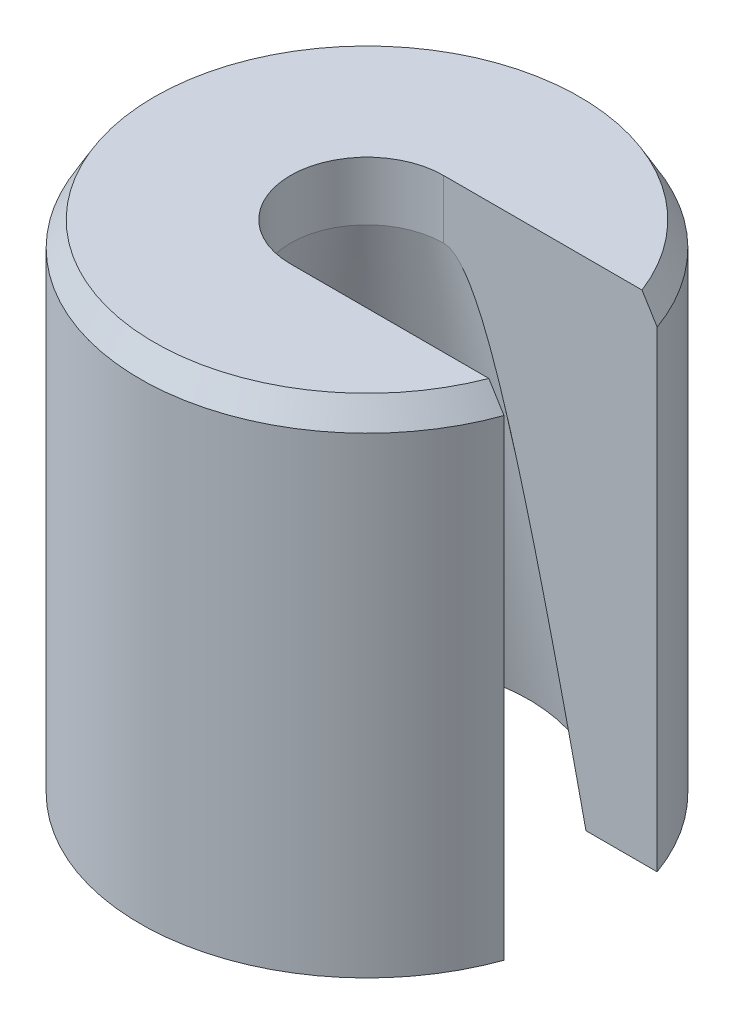
ISO-10303-21;
HEADER;
FILE_DESCRIPTION(('STEP AP214'),'2;1');
FILE_NAME('part.step','',(''),(''),'','','');
FILE_SCHEMA(('AUTOMOTIVE_DESIGN { 1 0 10303 214 1 1 1 1 }'));
ENDSEC;
DATA;
#1=APPLICATION_CONTEXT('core data for automotive mechanical design processes');
#2=APPLICATION_PROTOCOL_DEFINITION('international standard','automotive_design',2000,#1);
#3=PRODUCT_CONTEXT('',#1,'mechanical');
#4=PRODUCT('Part','Part','',(#3));
#5=PRODUCT_RELATED_PRODUCT_CATEGORY('part','',(#4));
#6=PRODUCT_DEFINITION_FORMATION('','',#4);
#7=PRODUCT_DEFINITION_CONTEXT('part definition',#1,'design');
#8=PRODUCT_DEFINITION('design','',#6,#7);
#9=PRODUCT_DEFINITION_SHAPE('','',#8);
#10=(LENGTH_UNIT() NAMED_UNIT(*) SI_UNIT(.MILLI.,.METRE.));
#11=(NAMED_UNIT(*) PLANE_ANGLE_UNIT() SI_UNIT($,.RADIAN.));
#12=(NAMED_UNIT(*) SI_UNIT($,.STERADIAN.) SOLID_ANGLE_UNIT());
#13=UNCERTAINTY_MEASURE_WITH_UNIT(LENGTH_MEASURE(1.E-05),#10,'distance_accuracy_value','');
#14=(GEOMETRIC_REPRESENTATION_CONTEXT(3) GLOBAL_UNCERTAINTY_ASSIGNED_CONTEXT((#13)) GLOBAL_UNIT_ASSIGNED_CONTEXT((#10,
#11,#12)) REPRESENTATION_CONTEXT('',''));
#15=CARTESIAN_POINT('',(0.,0.,0.));
#16=DIRECTION('',(0.,0.,1.));
#17=DIRECTION('',(1.,0.,0.));
#18=AXIS2_PLACEMENT_3D('',#15,#16,#17);
#19=CARTESIAN_POINT('',(0.,17.5,0.));
#20=DIRECTION('',(0.,1.,0.));
#21=DIRECTION('',(0.,0.,1.));
#22=AXIS2_PLACEMENT_3D('',#19,#20,#21);
#23=PLANE('',#22);
#24=DIRECTION('',(-1.,0.,0.));
#25=VECTOR('',#24,1.);
#26=CARTESIAN_POINT('',(0.,17.5,-2.7));
#27=LINE('',#26,#25);
#28=CARTESIAN_POINT('',(6.99714227381436,17.5,-2.7));
#29=VERTEX_POINT('',#28);
#30=CARTESIAN_POINT('',(0.,17.5,-2.7));
#31=VERTEX_POINT('',#30);
#32=EDGE_CURVE('E106',#29,#31,#27,.T.);
#33=ORIENTED_EDGE('',*,*,#32,.F.);
#34=CARTESIAN_POINT('',(0.,17.5,0.));
#35=DIRECTION('',(0.,1.,0.));
#36=DIRECTION('',(0.,0.,1.));
#37=AXIS2_PLACEMENT_3D('',#34,#35,#36);
#38=CIRCLE('',#37,7.5);
#39=CARTESIAN_POINT('',(6.99714227381436,17.5,2.7));
#40=VERTEX_POINT('',#39);
#41=EDGE_CURVE('E114',#29,#40,#38,.T.);
#42=ORIENTED_EDGE('',*,*,#41,.T.);
#43=DIRECTION('',(1.,0.,0.));
#44=VECTOR('',#43,1.);
#45=CARTESIAN_POINT('',(0.,17.5,2.7));
#46=LINE('',#45,#44);
#47=CARTESIAN_POINT('',(0.,17.5,2.7));
#48=VERTEX_POINT('',#47);
#49=EDGE_CURVE('E61',#48,#40,#46,.T.);
#50=ORIENTED_EDGE('',*,*,#49,.F.);
#51=CARTESIAN_POINT('',(0.,17.5,0.));
#52=DIRECTION('',(0.,1.,0.));
#53=DIRECTION('',(0.,0.,1.));
#54=AXIS2_PLACEMENT_3D('',#51,#52,#53);
#55=CIRCLE('',#54,2.7);
#56=EDGE_CURVE('E112',#31,#48,#55,.T.);
#57=ORIENTED_EDGE('',*,*,#56,.F.);
#58=EDGE_LOOP('',(#33,#42,#50,#57));
#59=FACE_BOUND('',#58,.T.);
#60=ADVANCED_FACE('F39',(#59),#23,.T.);
#61=CARTESIAN_POINT('',(0.,0.,0.));
#62=DIRECTION('',(0.,1.,0.));
#63=DIRECTION('',(0.,0.,1.));
#64=AXIS2_PLACEMENT_3D('',#61,#62,#63);
#65=PLANE('',#64);
#66=CARTESIAN_POINT('',(0.,0.,0.));
#67=DIRECTION('',(0.,1.,0.));
#68=DIRECTION('',(0.,0.,1.));
#69=AXIS2_PLACEMENT_3D('',#66,#67,#68);
#70=CIRCLE('',#69,8.);
#71=CARTESIAN_POINT('',(7.53060422542574,0.,-2.7));
#72=VERTEX_POINT('',#71);
#73=CARTESIAN_POINT('',(7.53060422542574,0.,2.7));
#74=VERTEX_POINT('',#73);
#75=EDGE_CURVE('E120',#72,#74,#70,.T.);
#76=ORIENTED_EDGE('',*,*,#75,.F.);
#77=DIRECTION('',(-1.,0.,0.));
#78=VECTOR('',#77,1.);
#79=CARTESIAN_POINT('',(0.,0.,-2.7));
#80=LINE('',#79,#78);
#81=CARTESIAN_POINT('',(5.01996015920448,0.,-2.7));
#82=VERTEX_POINT('',#81);
#83=EDGE_CURVE('E128',#72,#82,#80,.T.);
#84=ORIENTED_EDGE('',*,*,#83,.T.);
#85=CARTESIAN_POINT('',(0.,0.,0.));
#86=DIRECTION('',(0.,1.,0.));
#87=DIRECTION('',(0.,0.,1.));
#88=AXIS2_PLACEMENT_3D('',#85,#86,#87);
#89=CIRCLE('',#88,5.70000000000002);
#90=CARTESIAN_POINT('',(5.01996015920448,0.,2.7));
#91=VERTEX_POINT('',#90);
#92=EDGE_CURVE('E126',#82,#91,#89,.T.);
#93=ORIENTED_EDGE('',*,*,#92,.T.);
#94=DIRECTION('',(1.,0.,0.));
#95=VECTOR('',#94,1.);
#96=CARTESIAN_POINT('',(0.,0.,2.7));
#97=LINE('',#96,#95);
#98=EDGE_CURVE('E168',#91,#74,#97,.T.);
#99=ORIENTED_EDGE('',*,*,#98,.T.);
#100=EDGE_LOOP('',(#76,#84,#93,#99));
#101=FACE_BOUND('',#100,.T.);
#102=ADVANCED_FACE('F179',(#101),#65,.F.);
#103=CARTESIAN_POINT('',(0.,17.5,0.));
#104=DIRECTION('',(0.,-1.,0.));
#105=DIRECTION('',(0.,0.,-1.));
#106=AXIS2_PLACEMENT_3D('',#103,#104,#105);
#107=CYLINDRICAL_SURFACE('',#106,8.);
#108=CARTESIAN_POINT('',(0.,16.6339745962156,0.));
#109=DIRECTION('',(0.,1.,0.));
#110=DIRECTION('',(0.,0.,1.));
#111=AXIS2_PLACEMENT_3D('',#108,#109,#110);
#112=CIRCLE('',#111,8.);
#113=CARTESIAN_POINT('',(7.53060422542574,16.6339745962156,2.7));
#114=VERTEX_POINT('',#113);
#115=CARTESIAN_POINT('',(7.53060422542574,16.6339745962156,-2.7));
#116=VERTEX_POINT('',#115);
#117=EDGE_CURVE('E144',#114,#116,#112,.F.);
#118=ORIENTED_EDGE('',*,*,#117,.T.);
#119=DIRECTION('',(0.,-1.,0.));
#120=VECTOR('',#119,1.);
#121=CARTESIAN_POINT('',(7.53060422542574,17.5,-2.7));
#122=LINE('',#121,#120);
#123=EDGE_CURVE('E68',#116,#72,#122,.T.);
#124=ORIENTED_EDGE('',*,*,#123,.T.);
#125=ORIENTED_EDGE('',*,*,#75,.T.);
#126=DIRECTION('',(0.,-1.,0.));
#127=VECTOR('',#126,1.);
#128=CARTESIAN_POINT('',(7.53060422542574,17.5,2.7));
#129=LINE('',#128,#127);
#130=EDGE_CURVE('E245',#74,#114,#129,.F.);
#131=ORIENTED_EDGE('',*,*,#130,.T.);
#132=EDGE_LOOP('',(#118,#124,#125,#131));
#133=FACE_BOUND('',#132,.T.);
#134=ADVANCED_FACE('F175',(#133),#107,.T.);
#135=CARTESIAN_POINT('',(0.,17.5,0.));
#136=DIRECTION('',(0.,-1.,0.));
#137=DIRECTION('',(0.,0.,-1.));
#138=AXIS2_PLACEMENT_3D('',#135,#136,#137);
#139=CYLINDRICAL_SURFACE('',#138,2.7);
#140=DIRECTION('',(0.,1.,0.));
#141=VECTOR('',#140,1.);
#142=CARTESIAN_POINT('',(0.,-2.5,-2.7));
#143=LINE('',#142,#141);
#144=CARTESIAN_POINT('',(0.,15.4336620479109,-2.7));
#145=VERTEX_POINT('',#144);
#146=EDGE_CURVE('E105',#145,#31,#143,.T.);
#147=ORIENTED_EDGE('',*,*,#146,.T.);
#148=ORIENTED_EDGE('',*,*,#56,.T.);
#149=DIRECTION('',(0.,1.,0.));
#150=VECTOR('',#149,1.);
#151=CARTESIAN_POINT('',(0.,-2.5,2.7));
#152=LINE('',#151,#150);
#153=CARTESIAN_POINT('',(0.,15.4336620479109,2.7));
#154=VERTEX_POINT('',#153);
#155=EDGE_CURVE('E96',#154,#48,#152,.T.);
#156=ORIENTED_EDGE('',*,*,#155,.F.);
#157=CARTESIAN_POINT('',(0.,15.433662047911,0.));
#158=DIRECTION('',(0.,1.,0.));
#159=DIRECTION('',(0.,0.,1.));
#160=AXIS2_PLACEMENT_3D('',#157,#158,#159);
#161=CIRCLE('',#160,2.7);
#162=EDGE_CURVE('E139',#154,#145,#161,.F.);
#163=ORIENTED_EDGE('',*,*,#162,.T.);
#164=EDGE_LOOP('',(#147,#148,#156,#163));
#165=FACE_BOUND('',#164,.T.);
#166=ADVANCED_FACE('F118',(#165),#139,.F.);
#167=CARTESIAN_POINT('',(0.,0.,0.));
#168=DIRECTION('',(0.,-1.,0.));
#169=DIRECTION('',(0.,0.,-1.));
#170=AXIS2_PLACEMENT_3D('',#167,#168,#169);
#171=CONICAL_SURFACE('',#170,5.70000000000002,0.191986217719377);
#172=CARTESIAN_POINT('',(-8.47857163432991,-16.4527962756377,-2.7));
#173=CARTESIAN_POINT('',(-8.35347558736336,-15.8395846377863,-2.7));
#174=CARTESIAN_POINT('',(-8.22813857623328,-15.2264221339872,-2.7));
#175=CARTESIAN_POINT('',(-7.97690269151594,-14.0002111140494,-2.7));
#176=CARTESIAN_POINT('',(-7.85100381692304,-13.3871625981167,-2.7));
#177=CARTESIAN_POINT('',(-7.47215871668289,-11.5473094017157,-2.7));
#178=CARTESIAN_POINT('',(-7.21824857176457,-10.3207029660901,-2.7));
#179=CARTESIAN_POINT('',(-6.70970524634756,-7.88142713745908,-2.7));
#180=CARTESIAN_POINT('',(-6.45510933987036,-6.66874999103889,-2.7));
#181=CARTESIAN_POINT('',(-6.06968372939195,-4.85093025248333,-2.7));
#182=CARTESIAN_POINT('',(-5.94066613227017,-4.2454035143719,-2.7));
#183=CARTESIAN_POINT('',(-5.68116165587955,-3.03467356618218,-2.7));
#184=CARTESIAN_POINT('',(-5.55067479719474,-2.4294703516955,-2.7));
#185=CARTESIAN_POINT('',(-5.28057298076782,-1.18572891654576,-2.7));
#186=CARTESIAN_POINT('',(-5.1408546665672,-0.547213113375262,-2.7));
#187=CARTESIAN_POINT('',(-4.85886085023562,0.729290207673032,-2.7));
#188=CARTESIAN_POINT('',(-4.7165852114777,1.36727769540897,-2.7));
#189=CARTESIAN_POINT('',(-4.42840799555084,2.64389992895155,-2.7));
#190=CARTESIAN_POINT('',(-4.28249917727752,3.28253304477056,-2.7));
#191=CARTESIAN_POINT('',(-3.98623845544762,4.55864084693646,-2.7));
#192=CARTESIAN_POINT('',(-3.83588740800747,5.19611573168517,-2.7));
#193=CARTESIAN_POINT('',(-3.52652690158022,6.47970052470099,-2.7));
#194=CARTESIAN_POINT('',(-3.36741780442277,7.12578663078719,-2.7));
#195=CARTESIAN_POINT('',(-3.12143986383653,8.09331582743076,-2.7));
#196=CARTESIAN_POINT('',(-3.03819558760417,8.41567944864158,-2.7));
#197=CARTESIAN_POINT('',(-2.86862022610052,9.05957857176125,-2.7));
#198=CARTESIAN_POINT('',(-2.78228930729853,9.38111411733036,-2.7));
#199=CARTESIAN_POINT('',(-2.60605893854554,10.0214754361596,-2.7));
#200=CARTESIAN_POINT('',(-2.51617954396619,10.3403067136348,-2.7));
#201=CARTESIAN_POINT('',(-2.33106758921187,10.9765028998141,-2.7));
#202=CARTESIAN_POINT('',(-2.23583388070692,11.2938674780422,-2.7));
#203=CARTESIAN_POINT('',(-2.08733349560219,11.7679267840923,-2.7));
#204=CARTESIAN_POINT('',(-2.03692535714645,11.9255163572117,-2.7));
#205=CARTESIAN_POINT('',(-1.93376439315124,12.2399243829101,-2.7));
#206=CARTESIAN_POINT('',(-1.88101164023087,12.3967428592053,-2.7));
#207=CARTESIAN_POINT('',(-1.77259081341838,12.7093076823261,-2.7));
#208=CARTESIAN_POINT('',(-1.71692381422007,12.8650544007452,-2.7));
#209=CARTESIAN_POINT('',(-1.60181557549551,13.1751410537536,-2.7));
#210=CARTESIAN_POINT('',(-1.54237479587552,13.3294811571539,-2.7));
#211=CARTESIAN_POINT('',(-1.44992070970538,13.5581338073009,-2.7));
#212=CARTESIAN_POINT('',(-1.41884059059019,13.63322818019,-2.7));
#213=CARTESIAN_POINT('',(-1.35521272029393,13.7828074296983,-2.7));
#214=CARTESIAN_POINT('',(-1.32266476461447,13.8572922196723,-2.7));
#215=CARTESIAN_POINT('',(-1.25565713629634,14.0058325051661,-2.7));
#216=CARTESIAN_POINT('',(-1.22118900106296,14.0798841979483,-2.7));
#217=CARTESIAN_POINT('',(-1.15010006520151,14.2269314536475,-2.7));
#218=CARTESIAN_POINT('',(-1.11347978692263,14.2999272675223,-2.7));
#219=CARTESIAN_POINT('',(-1.03840796336672,14.4428503202888,-2.7));
#220=CARTESIAN_POINT('',(-1.00001767205177,14.5128095408226,-2.7));
#221=CARTESIAN_POINT('',(-0.919946481973054,14.6508137921548,-2.7));
#222=CARTESIAN_POINT('',(-0.878266693128599,14.7188594581897,-2.7));
#223=CARTESIAN_POINT('',(-0.790838973308571,14.8516685256046,-2.7));
#224=CARTESIAN_POINT('',(-0.745119501022801,14.9164505190216,-2.7));
#225=CARTESIAN_POINT('',(-0.647869159252178,15.0414459214839,-2.7));
#226=CARTESIAN_POINT('',(-0.596352878875433,15.1016701887542,-2.7));
#227=CARTESIAN_POINT('',(-0.522964242242884,15.1757843802891,-2.7));
#228=CARTESIAN_POINT('',(-0.504777165260782,15.193314573493,-2.7));
#229=CARTESIAN_POINT('',(-0.467452793757411,15.2273418253731,-2.7));
#230=CARTESIAN_POINT('',(-0.448315062560795,15.2438384012492,-2.7));
#231=CARTESIAN_POINT('',(-0.389384579919807,15.2913781106566,-2.7));
#232=CARTESIAN_POINT('',(-0.34799557766629,15.3205539616834,-2.7));
#233=CARTESIAN_POINT('',(-0.27424074091154,15.3630361991678,-2.7));
#234=CARTESIAN_POINT('',(-0.243103546269649,15.3784516749889,-2.7));
#235=CARTESIAN_POINT('',(-0.178773415485492,15.4042209742571,-2.7));
#236=CARTESIAN_POINT('',(-0.145582765287812,15.4145803159854,-2.7));
#237=CARTESIAN_POINT('',(-0.0774287528089032,15.4290631516223,-2.7));
#238=CARTESIAN_POINT('',(-0.0424497515230398,15.4331158303742,-2.7));
#239=CARTESIAN_POINT('',(0.0276012868857057,15.4341032427214,-2.7));
#240=CARTESIAN_POINT('',(0.0626732749025255,15.4310411875206,-2.7));
#241=CARTESIAN_POINT('',(0.126598864809767,15.4192340894243,-2.7));
#242=CARTESIAN_POINT('',(0.15562340495997,15.411366224127,-2.7));
#243=CARTESIAN_POINT('',(0.212238398607494,15.391572029201,-2.7));
#244=CARTESIAN_POINT('',(0.239827998069818,15.3796433138279,-2.7));
#245=CARTESIAN_POINT('',(0.31345996996833,15.3424302841791,-2.7));
#246=CARTESIAN_POINT('',(0.357815952042778,15.313840523245,-2.7));
#247=CARTESIAN_POINT('',(0.441885373939338,15.2505009405081,-2.7));
#248=CARTESIAN_POINT('',(0.48158106373445,15.2157287592987,-2.7));
#249=CARTESIAN_POINT('',(0.572068914981071,15.1278067485084,-2.7));
#250=CARTESIAN_POINT('',(0.621052202262486,15.0728223866828,-2.7));
#251=CARTESIAN_POINT('',(0.713675909629263,14.958468707427,-2.7));
#252=CARTESIAN_POINT('',(0.757303906284026,14.8990896877411,-2.7));
#253=CARTESIAN_POINT('',(0.840781319139245,14.7772317277931,-2.7));
#254=CARTESIAN_POINT('',(0.880606291931673,14.7147362141181,-2.7));
#255=CARTESIAN_POINT('',(0.957091879714393,14.587958658497,-2.7));
#256=CARTESIAN_POINT('',(0.993756068831476,14.5236787460361,-2.7));
#257=CARTESIAN_POINT('',(1.06836641460233,14.386962830923,-2.7));
#258=CARTESIAN_POINT('',(1.10604193684977,14.3143799734471,-2.7));
#259=CARTESIAN_POINT('',(1.17903323206355,14.1680326020982,-2.7));
#260=CARTESIAN_POINT('',(1.21434863584892,14.0942679055831,-2.7));
#261=CARTESIAN_POINT('',(1.31748716973211,13.8715732873745,-2.7));
#262=CARTESIAN_POINT('',(1.38245927381345,13.721325128695,-2.7));
#263=CARTESIAN_POINT('',(1.50728131731533,13.418307355831,-2.7));
#264=CARTESIAN_POINT('',(1.56711777985911,13.2655322912168,-2.7));
#265=CARTESIAN_POINT('',(1.68283354337802,12.9585553575759,-2.7));
#266=CARTESIAN_POINT('',(1.73871415280068,12.8043539795814,-2.7));
#267=CARTESIAN_POINT('',(1.84746771902964,12.4948260093291,-2.7));
#268=CARTESIAN_POINT('',(1.90033936544661,12.3394989595438,-2.7));
#269=CARTESIAN_POINT('',(2.00367357246785,12.0280344438274,-2.7));
#270=CARTESIAN_POINT('',(2.05413593908959,11.871896913759,-2.7));
#271=CARTESIAN_POINT('',(2.15301874956585,11.5592447817191,-2.7));
#272=CARTESIAN_POINT('',(2.20144223899067,11.4027311401635,-2.7));
#273=CARTESIAN_POINT('',(2.29665777863099,11.0892151845514,-2.7));
#274=CARTESIAN_POINT('',(2.34344988122475,10.9322128863608,-2.7));
#275=CARTESIAN_POINT('',(2.48086635490904,10.4637102113271,-2.7));
#276=CARTESIAN_POINT('',(2.56949539249074,10.1516245555785,-2.7));
#277=CARTESIAN_POINT('',(2.74279703403539,9.52635370692835,-2.7));
#278=CARTESIAN_POINT('',(2.82746950956379,9.21316847868764,-2.7));
#279=CARTESIAN_POINT('',(2.99376638693557,8.58595583775556,-2.7));
#280=CARTESIAN_POINT('',(3.07539046296478,8.27192833886459,-2.7));
#281=CARTESIAN_POINT('',(3.23621163396229,7.6432515569535,-2.7));
#282=CARTESIAN_POINT('',(3.31540870864176,7.32860226875884,-2.7));
#283=CARTESIAN_POINT('',(3.55021629026592,6.38335960127442,-2.7));
#284=CARTESIAN_POINT('',(3.70289485479985,5.75203830433842,-2.7));
#285=CARTESIAN_POINT('',(4.00286900578625,4.48816738134904,-2.7));
#286=CARTESIAN_POINT('',(4.15016491821175,3.85561783212996,-2.7));
#287=CARTESIAN_POINT('',(4.44051609353669,2.59096688390229,-2.7));
#288=CARTESIAN_POINT('',(4.58357972525182,1.95886740294623,-2.7));
#289=CARTESIAN_POINT('',(4.8667510665738,0.693998175060042,-2.7));
#290=CARTESIAN_POINT('',(5.00685873146525,0.0612284181423845,-2.7));
#291=CARTESIAN_POINT('',(5.28472149627278,-1.20458972776864,-2.7));
#292=CARTESIAN_POINT('',(5.42247741918848,-1.83763793632317,-2.7));
#293=CARTESIAN_POINT('',(5.69615561547141,-3.10413079228987,-2.7));
#294=CARTESIAN_POINT('',(5.83207788700969,-3.73757544009682,-2.7));
#295=CARTESIAN_POINT('',(6.18170427900132,-5.3762873201966,-2.7));
#296=CARTESIAN_POINT('',(6.39428563417714,-6.38179401379609,-2.7));
#297=CARTESIAN_POINT('',(6.81672070037096,-8.39349207173747,-2.7));
#298=CARTESIAN_POINT('',(7.02657411555349,-9.39968349808812,-2.7));
#299=CARTESIAN_POINT('',(7.44440266842484,-11.4135588366521,-2.7));
#300=CARTESIAN_POINT('',(7.65237560044429,-12.4212432060829,-2.7));
#301=CARTESIAN_POINT('',(8.06662884168974,-14.4368420607378,-2.7));
#302=CARTESIAN_POINT('',(8.27290933824886,-15.4447565074465,-2.7));
#303=CARTESIAN_POINT('',(8.47857163432991,-16.4527962756377,-2.7));
#304=B_SPLINE_CURVE_WITH_KNOTS('',3,(#172,#173,#174,#175,#176,#177,#178,#179,#180,#181,#182,
#183,#184,#185,#186,#187,#188,#189,#190,#191,#192,#193,#194,#195,#196,#197,#198,#199,#200,#201,
#202,#203,#204,#205,#206,#207,#208,#209,#210,#211,#212,#213,#214,#215,#216,#217,#218,#219,#220,
#221,#222,#223,#224,#225,#226,#227,#228,#229,#230,#231,#232,#233,#234,#235,#236,#237,#238,#239,
#240,#241,#242,#243,#244,#245,#246,#247,#248,#249,#250,#251,#252,#253,#254,#255,#256,#257,#258,
#259,#260,#261,#262,#263,#264,#265,#266,#267,#268,#269,#270,#271,#272,#273,#274,#275,#276,#277,
#278,#279,#280,#281,#282,#283,#284,#285,#286,#287,#288,#289,#290,#291,#292,#293,#294,#295,#296,
#297,#298,#299,#300,#301,#302,#303),.UNSPECIFIED.,.F.,.F.,(4,2,2,2,2,2,2,2,2,2,2,2,2,2,2,2,2,2,
2,2,2,2,2,2,2,2,2,2,2,2,2,2,2,2,2,2,2,2,2,2,2,2,2,2,2,2,2,2,2,2,2,2,2,2,2,2,2,2,2,2,2,2,2,2,2,
4),(0.,1.87752433797444,3.75505203778901,7.51288093898003,11.2302166942051,13.0875718731159,
14.944901063177,16.9057673617281,18.8667387342471,20.8319933180812,22.7968715928886,
24.7929811342628,25.7917850623989,26.7905352038925,27.7842793284677,28.7782373986184,
29.2745896598611,29.7709265584174,30.2670816935297,30.7631764784266,31.0069805107286,
31.2508186152791,31.4958326735612,31.7407875078374,31.9801249262929,32.2193819316269,
32.4570705492249,32.6941738072608,32.7699177668096,32.8456968463994,32.9969137508289,
33.1008172115799,33.204607016755,33.3095540390077,33.4144537030852,33.5043224206125,
33.5942440272797,33.751633574144,33.9096043663219,34.1299616175183,34.3508207709127,
34.5730154094256,34.7949554074222,35.0402342901513,35.2855514511972,35.776464422433,
36.2686285804278,36.7606291809531,37.2528424311477,37.7450952451614,38.2365845906206,
38.7280581414788,39.7012970843497,40.6745675977593,41.6479418387408,42.6213242145536,
44.5698467114652,46.5182510097725,48.4625027806969,50.4067839415772,52.35037013909,
54.2939582750561,57.3771506453647,60.4606746334888,63.5474391333594,66.6338572251413),.UNSPECIFIED.);
#305=EDGE_CURVE('E121',#145,#82,#304,.T.);
#306=ORIENTED_EDGE('',*,*,#305,.F.);
#307=ORIENTED_EDGE('',*,*,#162,.F.);
#308=CARTESIAN_POINT('',(8.47857163432991,-16.4527962756377,2.7));
#309=CARTESIAN_POINT('',(8.35347558736336,-15.8395846377863,2.7));
#310=CARTESIAN_POINT('',(8.22813857623328,-15.2264221339872,2.7));
#311=CARTESIAN_POINT('',(7.97690269151594,-14.0002111140494,2.7));
#312=CARTESIAN_POINT('',(7.85100381692304,-13.3871625981167,2.7));
#313=CARTESIAN_POINT('',(7.47215871668289,-11.5473094017157,2.7));
#314=CARTESIAN_POINT('',(7.21824857176457,-10.3207029660901,2.7));
#315=CARTESIAN_POINT('',(6.70970524634756,-7.88142713745908,2.7));
#316=CARTESIAN_POINT('',(6.45510933987036,-6.66874999103889,2.7));
#317=CARTESIAN_POINT('',(6.06968372939195,-4.85093025248333,2.7));
#318=CARTESIAN_POINT('',(5.94066613227017,-4.2454035143719,2.7));
#319=CARTESIAN_POINT('',(5.68116165587955,-3.03467356618218,2.7));
#320=CARTESIAN_POINT('',(5.55067479719474,-2.4294703516955,2.7));
#321=CARTESIAN_POINT('',(5.28057298076782,-1.18572891654576,2.7));
#322=CARTESIAN_POINT('',(5.1408546665672,-0.547213113375262,2.7));
#323=CARTESIAN_POINT('',(4.85886085023562,0.729290207673032,2.7));
#324=CARTESIAN_POINT('',(4.7165852114777,1.36727769540897,2.7));
#325=CARTESIAN_POINT('',(4.42840799555084,2.64389992895155,2.7));
#326=CARTESIAN_POINT('',(4.28249917727752,3.28253304477056,2.7));
#327=CARTESIAN_POINT('',(3.98623845544762,4.55864084693646,2.7));
#328=CARTESIAN_POINT('',(3.83588740800747,5.19611573168517,2.7));
#329=CARTESIAN_POINT('',(3.52652690158022,6.47970052470099,2.7));
#330=CARTESIAN_POINT('',(3.36741780442277,7.12578663078719,2.7));
#331=CARTESIAN_POINT('',(3.12143986383653,8.09331582743076,2.7));
#332=CARTESIAN_POINT('',(3.03819558760417,8.41567944864158,2.7));
#333=CARTESIAN_POINT('',(2.86862022610052,9.05957857176125,2.7));
#334=CARTESIAN_POINT('',(2.78228930729853,9.38111411733036,2.7));
#335=CARTESIAN_POINT('',(2.60605893854554,10.0214754361596,2.7));
#336=CARTESIAN_POINT('',(2.51617954396619,10.3403067136348,2.7));
#337=CARTESIAN_POINT('',(2.33106758921187,10.9765028998141,2.7));
#338=CARTESIAN_POINT('',(2.23583388070692,11.2938674780422,2.7));
#339=CARTESIAN_POINT('',(2.08733349560219,11.7679267840923,2.7));
#340=CARTESIAN_POINT('',(2.03692535714645,11.9255163572117,2.7));
#341=CARTESIAN_POINT('',(1.93376439315124,12.2399243829101,2.7));
#342=CARTESIAN_POINT('',(1.88101164023087,12.3967428592053,2.7));
#343=CARTESIAN_POINT('',(1.77259081341838,12.7093076823261,2.7));
#344=CARTESIAN_POINT('',(1.71692381422007,12.8650544007452,2.7));
#345=CARTESIAN_POINT('',(1.60181557549551,13.1751410537536,2.7));
#346=CARTESIAN_POINT('',(1.54237479587552,13.3294811571539,2.7));
#347=CARTESIAN_POINT('',(1.44992070970538,13.5581338073009,2.7));
#348=CARTESIAN_POINT('',(1.41884059059019,13.63322818019,2.7));
#349=CARTESIAN_POINT('',(1.35521272029393,13.7828074296983,2.7));
#350=CARTESIAN_POINT('',(1.32266476461447,13.8572922196723,2.7));
#351=CARTESIAN_POINT('',(1.25565713629634,14.0058325051661,2.7));
#352=CARTESIAN_POINT('',(1.22118900106296,14.0798841979483,2.7));
#353=CARTESIAN_POINT('',(1.15010006520151,14.2269314536475,2.7));
#354=CARTESIAN_POINT('',(1.11347978692263,14.2999272675223,2.7));
#355=CARTESIAN_POINT('',(1.03840796336672,14.4428503202888,2.7));
#356=CARTESIAN_POINT('',(1.00001767205177,14.5128095408226,2.7));
#357=CARTESIAN_POINT('',(0.919946481973054,14.6508137921548,2.7));
#358=CARTESIAN_POINT('',(0.878266693128599,14.7188594581897,2.7));
#359=CARTESIAN_POINT('',(0.790838973308571,14.8516685256046,2.7));
#360=CARTESIAN_POINT('',(0.745119501022801,14.9164505190216,2.7));
#361=CARTESIAN_POINT('',(0.647869159252178,15.0414459214839,2.7));
#362=CARTESIAN_POINT('',(0.596352878875433,15.1016701887542,2.7));
#363=CARTESIAN_POINT('',(0.522964242242884,15.1757843802891,2.7));
#364=CARTESIAN_POINT('',(0.504777165260782,15.193314573493,2.7));
#365=CARTESIAN_POINT('',(0.467452793757411,15.2273418253731,2.7));
#366=CARTESIAN_POINT('',(0.448315062560795,15.2438384012492,2.7));
#367=CARTESIAN_POINT('',(0.389384579919807,15.2913781106566,2.7));
#368=CARTESIAN_POINT('',(0.34799557766629,15.3205539616834,2.7));
#369=CARTESIAN_POINT('',(0.27424074091154,15.3630361991678,2.7));
#370=CARTESIAN_POINT('',(0.243103546269649,15.3784516749889,2.7));
#371=CARTESIAN_POINT('',(0.178773415485492,15.4042209742571,2.7));
#372=CARTESIAN_POINT('',(0.145582765287812,15.4145803159854,2.7));
#373=CARTESIAN_POINT('',(0.0774287528089032,15.4290631516223,2.7));
#374=CARTESIAN_POINT('',(0.0424497515230398,15.4331158303742,2.7));
#375=CARTESIAN_POINT('',(-0.0276012868857057,15.4341032427214,2.7));
#376=CARTESIAN_POINT('',(-0.0626732749025255,15.4310411875206,2.7));
#377=CARTESIAN_POINT('',(-0.126598864809767,15.4192340894243,2.7));
#378=CARTESIAN_POINT('',(-0.15562340495997,15.411366224127,2.7));
#379=CARTESIAN_POINT('',(-0.212238398607494,15.391572029201,2.7));
#380=CARTESIAN_POINT('',(-0.239827998069818,15.3796433138279,2.7));
#381=CARTESIAN_POINT('',(-0.31345996996833,15.3424302841791,2.7));
#382=CARTESIAN_POINT('',(-0.357815952042778,15.313840523245,2.7));
#383=CARTESIAN_POINT('',(-0.441885373939338,15.2505009405081,2.7));
#384=CARTESIAN_POINT('',(-0.48158106373445,15.2157287592987,2.7));
#385=CARTESIAN_POINT('',(-0.572068914981071,15.1278067485084,2.7));
#386=CARTESIAN_POINT('',(-0.621052202262486,15.0728223866828,2.7));
#387=CARTESIAN_POINT('',(-0.713675909629263,14.958468707427,2.7));
#388=CARTESIAN_POINT('',(-0.757303906284026,14.8990896877411,2.7));
#389=CARTESIAN_POINT('',(-0.840781319139245,14.7772317277931,2.7));
#390=CARTESIAN_POINT('',(-0.880606291931673,14.7147362141181,2.7));
#391=CARTESIAN_POINT('',(-0.957091879714393,14.587958658497,2.7));
#392=CARTESIAN_POINT('',(-0.993756068831476,14.5236787460361,2.7));
#393=CARTESIAN_POINT('',(-1.06836641460233,14.386962830923,2.7));
#394=CARTESIAN_POINT('',(-1.10604193684977,14.3143799734471,2.7));
#395=CARTESIAN_POINT('',(-1.17903323206355,14.1680326020982,2.7));
#396=CARTESIAN_POINT('',(-1.21434863584892,14.0942679055831,2.7));
#397=CARTESIAN_POINT('',(-1.31748716973211,13.8715732873745,2.7));
#398=CARTESIAN_POINT('',(-1.38245927381345,13.721325128695,2.7));
#399=CARTESIAN_POINT('',(-1.50728131731533,13.418307355831,2.7));
#400=CARTESIAN_POINT('',(-1.56711777985911,13.2655322912168,2.7));
#401=CARTESIAN_POINT('',(-1.68283354337802,12.9585553575759,2.7));
#402=CARTESIAN_POINT('',(-1.73871415280068,12.8043539795814,2.7));
#403=CARTESIAN_POINT('',(-1.84746771902964,12.4948260093291,2.7));
#404=CARTESIAN_POINT('',(-1.90033936544661,12.3394989595438,2.7));
#405=CARTESIAN_POINT('',(-2.00367357246785,12.0280344438274,2.7));
#406=CARTESIAN_POINT('',(-2.05413593908959,11.871896913759,2.7));
#407=CARTESIAN_POINT('',(-2.15301874956585,11.5592447817191,2.7));
#408=CARTESIAN_POINT('',(-2.20144223899067,11.4027311401635,2.7));
#409=CARTESIAN_POINT('',(-2.29665777863099,11.0892151845514,2.7));
#410=CARTESIAN_POINT('',(-2.34344988122475,10.9322128863608,2.7));
#411=CARTESIAN_POINT('',(-2.48086635490904,10.4637102113271,2.7));
#412=CARTESIAN_POINT('',(-2.56949539249074,10.1516245555785,2.7));
#413=CARTESIAN_POINT('',(-2.74279703403539,9.52635370692835,2.7));
#414=CARTESIAN_POINT('',(-2.82746950956379,9.21316847868764,2.7));
#415=CARTESIAN_POINT('',(-2.99376638693557,8.58595583775556,2.7));
#416=CARTESIAN_POINT('',(-3.07539046296478,8.27192833886459,2.7));
#417=CARTESIAN_POINT('',(-3.23621163396229,7.6432515569535,2.7));
#418=CARTESIAN_POINT('',(-3.31540870864176,7.32860226875884,2.7));
#419=CARTESIAN_POINT('',(-3.55021629026592,6.38335960127442,2.7));
#420=CARTESIAN_POINT('',(-3.70289485479985,5.75203830433842,2.7));
#421=CARTESIAN_POINT('',(-4.00286900578625,4.48816738134904,2.7));
#422=CARTESIAN_POINT('',(-4.15016491821175,3.85561783212996,2.7));
#423=CARTESIAN_POINT('',(-4.44051609353669,2.59096688390229,2.7));
#424=CARTESIAN_POINT('',(-4.58357972525182,1.95886740294623,2.7));
#425=CARTESIAN_POINT('',(-4.8667510665738,0.693998175060042,2.7));
#426=CARTESIAN_POINT('',(-5.00685873146525,0.0612284181423845,2.7));
#427=CARTESIAN_POINT('',(-5.28472149627278,-1.20458972776864,2.7));
#428=CARTESIAN_POINT('',(-5.42247741918848,-1.83763793632317,2.7));
#429=CARTESIAN_POINT('',(-5.69615561547141,-3.10413079228987,2.7));
#430=CARTESIAN_POINT('',(-5.83207788700969,-3.73757544009682,2.7));
#431=CARTESIAN_POINT('',(-6.18170427900132,-5.3762873201966,2.7));
#432=CARTESIAN_POINT('',(-6.39428563417714,-6.38179401379609,2.7));
#433=CARTESIAN_POINT('',(-6.81672070037096,-8.39349207173747,2.7));
#434=CARTESIAN_POINT('',(-7.02657411555349,-9.39968349808812,2.7));
#435=CARTESIAN_POINT('',(-7.44440266842484,-11.4135588366521,2.7));
#436=CARTESIAN_POINT('',(-7.65237560044429,-12.4212432060829,2.7));
#437=CARTESIAN_POINT('',(-8.06662884168974,-14.4368420607378,2.7));
#438=CARTESIAN_POINT('',(-8.27290933824886,-15.4447565074465,2.7));
#439=CARTESIAN_POINT('',(-8.47857163432991,-16.4527962756377,2.7));
#440=B_SPLINE_CURVE_WITH_KNOTS('',3,(#308,#309,#310,#311,#312,#313,#314,#315,#316,#317,#318,
#319,#320,#321,#322,#323,#324,#325,#326,#327,#328,#329,#330,#331,#332,#333,#334,#335,#336,#337,
#338,#339,#340,#341,#342,#343,#344,#345,#346,#347,#348,#349,#350,#351,#352,#353,#354,#355,#356,
#357,#358,#359,#360,#361,#362,#363,#364,#365,#366,#367,#368,#369,#370,#371,#372,#373,#374,#375,
#376,#377,#378,#379,#380,#381,#382,#383,#384,#385,#386,#387,#388,#389,#390,#391,#392,#393,#394,
#395,#396,#397,#398,#399,#400,#401,#402,#403,#404,#405,#406,#407,#408,#409,#410,#411,#412,#413,
#414,#415,#416,#417,#418,#419,#420,#421,#422,#423,#424,#425,#426,#427,#428,#429,#430,#431,#432,
#433,#434,#435,#436,#437,#438,#439),.UNSPECIFIED.,.F.,.F.,(4,2,2,2,2,2,2,2,2,2,2,2,2,2,2,2,2,2,
2,2,2,2,2,2,2,2,2,2,2,2,2,2,2,2,2,2,2,2,2,2,2,2,2,2,2,2,2,2,2,2,2,2,2,2,2,2,2,2,2,2,2,2,2,2,2,
4),(0.,1.87752433797444,3.75505203778901,7.51288093898003,11.2302166942051,13.0875718731159,
14.944901063177,16.9057673617281,18.8667387342471,20.8319933180812,22.7968715928886,
24.7929811342628,25.7917850623989,26.7905352038925,27.7842793284677,28.7782373986184,
29.2745896598611,29.7709265584174,30.2670816935297,30.7631764784266,31.0069805107286,
31.2508186152791,31.4958326735612,31.7407875078374,31.9801249262929,32.2193819316269,
32.4570705492249,32.6941738072608,32.7699177668096,32.8456968463994,32.9969137508289,
33.1008172115799,33.204607016755,33.3095540390077,33.4144537030852,33.5043224206125,
33.5942440272797,33.751633574144,33.9096043663219,34.1299616175183,34.3508207709127,
34.5730154094256,34.7949554074222,35.0402342901513,35.2855514511972,35.776464422433,
36.2686285804278,36.7606291809531,37.2528424311477,37.7450952451614,38.2365845906206,
38.7280581414788,39.7012970843497,40.6745675977593,41.6479418387408,42.6213242145536,
44.5698467114652,46.5182510097725,48.4625027806969,50.4067839415772,52.35037013909,
54.2939582750561,57.3771506453647,60.4606746334888,63.5474391333594,66.6338572251413),.UNSPECIFIED.);
#441=EDGE_CURVE('E99',#91,#154,#440,.T.);
#442=ORIENTED_EDGE('',*,*,#441,.F.);
#443=ORIENTED_EDGE('',*,*,#92,.F.);
#444=EDGE_LOOP('',(#306,#307,#442,#443));
#445=FACE_BOUND('',#444,.T.);
#446=ADVANCED_FACE('F170',(#445),#171,.F.);
#447=CARTESIAN_POINT('',(0.,17.5,0.));
#448=DIRECTION('',(0.,-1.,0.));
#449=DIRECTION('',(0.,0.,-1.));
#450=AXIS2_PLACEMENT_3D('',#447,#448,#449);
#451=CONICAL_SURFACE('',#450,7.5,0.523598775598302);
#452=CARTESIAN_POINT('',(12.3543045013231,8.58703612650002,-2.7));
#453=CARTESIAN_POINT('',(12.0232479270894,9.14717965854198,-2.7));
#454=CARTESIAN_POINT('',(11.6917759763984,9.70707852124059,-2.7));
#455=CARTESIAN_POINT('',(11.0276465036163,10.8262303560783,-2.7));
#456=CARTESIAN_POINT('',(10.6949888928763,11.3854832755992,-2.7));
#457=CARTESIAN_POINT('',(10.0272651282906,12.5046407306581,-2.7));
#458=CARTESIAN_POINT('',(9.69219486358543,13.0645428157981,-2.7));
#459=CARTESIAN_POINT('',(9.02004809509475,14.1830885572491,-2.7));
#460=CARTESIAN_POINT('',(8.6829717327155,14.7417322985201,-2.7));
#461=CARTESIAN_POINT('',(7.9528931508946,15.944887760945,-2.7));
#462=CARTESIAN_POINT('',(7.55941777077096,16.5891132504087,-2.7));
#463=CARTESIAN_POINT('',(6.96478461535532,17.5528294759485,-2.7));
#464=CARTESIAN_POINT('',(6.76581331449452,17.8736686484783,-2.7));
#465=CARTESIAN_POINT('',(6.36598272108975,18.5141635590666,-2.7));
#466=CARTESIAN_POINT('',(6.16512345468126,18.8338193134223,-2.7));
#467=CARTESIAN_POINT('',(5.76128456065001,19.4710166998552,-2.7));
#468=CARTESIAN_POINT('',(5.55830920315073,19.7885610329337,-2.7));
#469=CARTESIAN_POINT('',(5.14902518354813,20.4215239370344,-2.7));
#470=CARTESIAN_POINT('',(4.94271632563694,20.7369423816297,-2.7));
#471=CARTESIAN_POINT('',(4.52556262021646,21.3646005001086,-2.7));
#472=CARTESIAN_POINT('',(4.31471964299251,21.6768414092662,-2.7));
#473=CARTESIAN_POINT('',(3.99337846282103,22.1416718889237,-2.7));
#474=CARTESIAN_POINT('',(3.88542420176662,22.2960191893305,-2.7));
#475=CARTESIAN_POINT('',(3.66740342637173,22.6032126630289,-2.7));
#476=CARTESIAN_POINT('',(3.55733697696037,22.7560588822465,-2.7));
#477=CARTESIAN_POINT('',(3.37352942965581,23.006655838881,-2.7));
#478=CARTESIAN_POINT('',(3.30055544058086,23.1049690835495,-2.7));
#479=CARTESIAN_POINT('',(3.15328288427174,23.3006056440777,-2.7));
#480=CARTESIAN_POINT('',(3.07898427112033,23.3979289254365,-2.7));
#481=CARTESIAN_POINT('',(2.92875059402643,23.5914560357599,-2.7));
#482=CARTESIAN_POINT('',(2.85281403026945,23.6876587027218,-2.7));
#483=CARTESIAN_POINT('',(2.69906728705475,23.8785531582972,-2.7));
#484=CARTESIAN_POINT('',(2.62125718076337,23.9732450056725,-2.7));
#485=CARTESIAN_POINT('',(2.46485846048546,24.1589485662951,-2.7));
#486=CARTESIAN_POINT('',(2.38631240534114,24.249996010553,-2.7));
#487=CARTESIAN_POINT('',(2.22655750450049,24.4297211715037,-2.7));
#488=CARTESIAN_POINT('',(2.14534890883961,24.5183991093022,-2.7));
#489=CARTESIAN_POINT('',(1.97974116677416,24.6925242459171,-2.7));
#490=CARTESIAN_POINT('',(1.8953462022596,24.7779754037782,-2.7));
#491=CARTESIAN_POINT('',(1.72248416330491,24.9446301268134,-2.7));
#492=CARTESIAN_POINT('',(1.63401902651441,25.0258356746142,-2.7));
#493=CARTESIAN_POINT('',(1.49502221514926,25.1452803570266,-2.7));
#494=CARTESIAN_POINT('',(1.44634168710955,25.1856734905901,-2.7));
#495=CARTESIAN_POINT('',(1.34738417732185,25.2644327741788,-2.7));
#496=CARTESIAN_POINT('',(1.29710767080766,25.3027995187026,-2.7));
#497=CARTESIAN_POINT('',(1.19443006301256,25.3773179360966,-2.7));
#498=CARTESIAN_POINT('',(1.14201741170403,25.4134538391689,-2.7));
#499=CARTESIAN_POINT('',(1.03514612346086,25.4826603745449,-2.7));
#500=CARTESIAN_POINT('',(0.980685692668921,25.5157282269748,-2.7));
#501=CARTESIAN_POINT('',(0.925135055270204,25.5469384697155,-2.7));
#502=B_SPLINE_CURVE_WITH_KNOTS('',3,(#452,#453,#454,#455,#456,#457,#458,#459,#460,#461,#462,
#463,#464,#465,#466,#467,#468,#469,#470,#471,#472,#473,#474,#475,#476,#477,#478,#479,#480,#481,
#482,#483,#484,#485,#486,#487,#488,#489,#490,#491,#492,#493,#494,#495,#496,#497,#498,#499,#500,
#501),.UNSPECIFIED.,.F.,.F.,(4,2,2,2,2,2,2,2,2,2,2,2,2,2,2,2,2,2,2,2,2,2,2,2,4),(0.,
1.95198268140102,3.90411450485666,5.86162513945431,7.81899938937918,10.0836266295913,
11.2162056403273,12.348768995573,13.4793727157594,14.6100430901328,15.7402556945293,
16.3053048797953,16.8703367230638,17.2376373719125,17.6049507778526,17.9726161396668,
18.3402671664783,18.7009645991044,19.0616282556164,19.4218339851017,19.7818699740849,
19.9715974715462,20.1612689943126,20.3521559452127,20.5432141979737),.UNSPECIFIED.);
#503=EDGE_CURVE('E11',#116,#29,#502,.T.);
#504=ORIENTED_EDGE('',*,*,#503,.F.);
#505=ORIENTED_EDGE('',*,*,#117,.F.);
#506=CARTESIAN_POINT('',(0.925135055270205,25.5469384697155,2.7));
#507=CARTESIAN_POINT('',(0.976145814783107,25.5182864569237,2.7));
#508=CARTESIAN_POINT('',(1.02623340349216,25.488060229542,2.7));
#509=CARTESIAN_POINT('',(1.12466696176428,25.4249753699349,2.7));
#510=CARTESIAN_POINT('',(1.17301439313926,25.3921190256587,2.7));
#511=CARTESIAN_POINT('',(1.31537916869407,25.2905508464989,2.7));
#512=CARTESIAN_POINT('',(1.40709507481919,25.2186200537169,2.7));
#513=CARTESIAN_POINT('',(1.58479971719327,25.0694201495675,2.7));
#514=CARTESIAN_POINT('',(1.67082656740982,24.9921955935753,2.7));
#515=CARTESIAN_POINT('',(1.79691675283216,24.873173274618,2.7));
#516=CARTESIAN_POINT('',(1.83847792377246,24.8329444726286,2.7));
#517=CARTESIAN_POINT('',(1.92070078542842,24.751578186664,2.7));
#518=CARTESIAN_POINT('',(1.96136247984184,24.7104407064258,2.7));
#519=CARTESIAN_POINT('',(2.09364005518109,24.5740015546215,2.7));
#520=CARTESIAN_POINT('',(2.18356082629075,24.4770546669824,2.7));
#521=CARTESIAN_POINT('',(2.36009669922579,24.2801862222483,2.7));
#522=CARTESIAN_POINT('',(2.44671109741045,24.1802640399358,2.7));
#523=CARTESIAN_POINT('',(2.61733169195772,23.9781118638583,2.7));
#524=CARTESIAN_POINT('',(2.70133614955428,23.8758804067586,2.7));
#525=CARTESIAN_POINT('',(2.86717493003019,23.6696687598126,2.7));
#526=CARTESIAN_POINT('',(2.94900912198358,23.5656884650794,2.7));
#527=CARTESIAN_POINT('',(3.19213463998034,23.2513182854745,2.7));
#528=CARTESIAN_POINT('',(3.35074960420519,23.0388601045989,2.7));
#529=CARTESIAN_POINT('',(3.66291708077145,22.6104128141289,2.7));
#530=CARTESIAN_POINT('',(3.81647149719577,22.3944250793987,2.7));
#531=CARTESIAN_POINT('',(4.12327843880054,21.9550750038086,2.7));
#532=CARTESIAN_POINT('',(4.27644871298477,21.7316553540838,2.7));
#533=CARTESIAN_POINT('',(4.57992689788367,21.2828559854666,2.7));
#534=CARTESIAN_POINT('',(4.73023453916405,21.057476084953,2.7));
#535=CARTESIAN_POINT('',(5.02842813056623,20.6055612334789,2.7));
#536=CARTESIAN_POINT('',(5.17631709128595,20.3790282659538,2.7));
#537=CARTESIAN_POINT('',(5.47034691181297,19.9248297470155,2.7));
#538=CARTESIAN_POINT('',(5.61648775736416,19.6971641863874,2.7));
#539=CARTESIAN_POINT('',(6.05427376535234,19.0105637668437,2.7));
#540=CARTESIAN_POINT('',(6.34380467690032,18.5502814299683,2.7));
#541=CARTESIAN_POINT('',(6.91910680962753,17.6273667002769,2.7));
#542=CARTESIAN_POINT('',(7.2048779432123,17.1647342530554,2.7));
#543=CARTESIAN_POINT('',(7.77390537780788,16.2375607285215,2.7));
#544=CARTESIAN_POINT('',(8.05716013941695,15.7730187072423,2.7));
#545=CARTESIAN_POINT('',(8.62170245880115,14.8427409740786,2.7));
#546=CARTESIAN_POINT('',(8.90299001276142,14.3770052598817,2.7));
#547=CARTESIAN_POINT('',(9.44987577198957,13.4682321641165,2.7));
#548=CARTESIAN_POINT('',(9.7155475018061,13.0252390022432,2.7));
#549=CARTESIAN_POINT('',(10.2458362528579,12.1386203389672,2.7));
#550=CARTESIAN_POINT('',(10.5104532709932,11.6949948357113,2.7));
#551=CARTESIAN_POINT('',(11.0386664933715,10.8075437235205,2.7));
#552=CARTESIAN_POINT('',(11.3022632677876,10.3637184538236,2.7));
#553=CARTESIAN_POINT('',(11.8287649406938,9.4756606258428,2.7));
#554=CARTESIAN_POINT('',(12.0916698425853,9.03142806957572,2.7));
#555=CARTESIAN_POINT('',(12.3543045013231,8.58703612650002,2.7));
#556=B_SPLINE_CURVE_WITH_KNOTS('',3,(#506,#507,#508,#509,#510,#511,#512,#513,#514,#515,#516,
#517,#518,#519,#520,#521,#522,#523,#524,#525,#526,#527,#528,#529,#530,#531,#532,#533,#534,#535,
#536,#537,#538,#539,#540,#541,#542,#543,#544,#545,#546,#547,#548,#549,#550,#551,#552,#553,#554,
#555),.UNSPECIFIED.,.F.,.F.,(4,2,2,2,2,2,2,2,2,2,2,2,2,2,2,2,2,2,2,2,2,2,2,2,4),(0.,
0.175440477628319,0.350729963660804,0.700007809605743,1.04664040956679,1.22015413949358,
1.39366715597114,1.7902403822423,2.18689753941175,2.58381352087536,2.98075339293295,
3.77603910292403,4.57102208048305,5.38363929859708,6.19633262691544,7.00792266752492,
7.8195193222562,9.4508033030206,11.0821252220081,12.7143845142121,14.3466469708428,
15.8962966284548,17.445950837342,18.9945550791245,20.543151693222),.UNSPECIFIED.);
#557=EDGE_CURVE('E54',#40,#114,#556,.T.);
#558=ORIENTED_EDGE('',*,*,#557,.F.);
#559=ORIENTED_EDGE('',*,*,#41,.F.);
#560=EDGE_LOOP('',(#504,#505,#558,#559));
#561=FACE_BOUND('',#560,.T.);
#562=ADVANCED_FACE('F41',(#561),#451,.T.);
#563=CARTESIAN_POINT('',(0.,-2.5,2.7));
#564=DIRECTION('',(0.,0.,1.));
#565=DIRECTION('',(1.,0.,0.));
#566=AXIS2_PLACEMENT_3D('',#563,#564,#565);
#567=PLANE('',#566);
#568=ORIENTED_EDGE('',*,*,#441,.T.);
#569=ORIENTED_EDGE('',*,*,#155,.T.);
#570=ORIENTED_EDGE('',*,*,#49,.T.);
#571=ORIENTED_EDGE('',*,*,#557,.T.);
#572=ORIENTED_EDGE('',*,*,#130,.F.);
#573=ORIENTED_EDGE('',*,*,#98,.F.);
#574=EDGE_LOOP('',(#568,#569,#570,#571,#572,#573));
#575=FACE_BOUND('',#574,.T.);
#576=ADVANCED_FACE('F97',(#575),#567,.F.);
#577=CARTESIAN_POINT('',(0.,-2.5,-2.7));
#578=DIRECTION('',(0.,0.,-1.));
#579=DIRECTION('',(-1.,0.,0.));
#580=AXIS2_PLACEMENT_3D('',#577,#578,#579);
#581=PLANE('',#580);
#582=ORIENTED_EDGE('',*,*,#305,.T.);
#583=ORIENTED_EDGE('',*,*,#83,.F.);
#584=ORIENTED_EDGE('',*,*,#123,.F.);
#585=ORIENTED_EDGE('',*,*,#503,.T.);
#586=ORIENTED_EDGE('',*,*,#32,.T.);
#587=ORIENTED_EDGE('',*,*,#146,.F.);
#588=EDGE_LOOP('',(#582,#583,#584,#585,#586,#587));
#589=FACE_BOUND('',#588,.T.);
#590=ADVANCED_FACE('F156',(#589),#581,.F.);
#591=CLOSED_SHELL('',(#60,#102,#134,#166,#446,#562,#576,#590));
#592=MANIFOLD_SOLID_BREP('B2',#591);
#593=ADVANCED_BREP_SHAPE_REPRESENTATION('',(#18,#592),#14);
#594=SHAPE_DEFINITION_REPRESENTATION(#9,#593);
ENDSEC;
END-ISO-10303-21;
